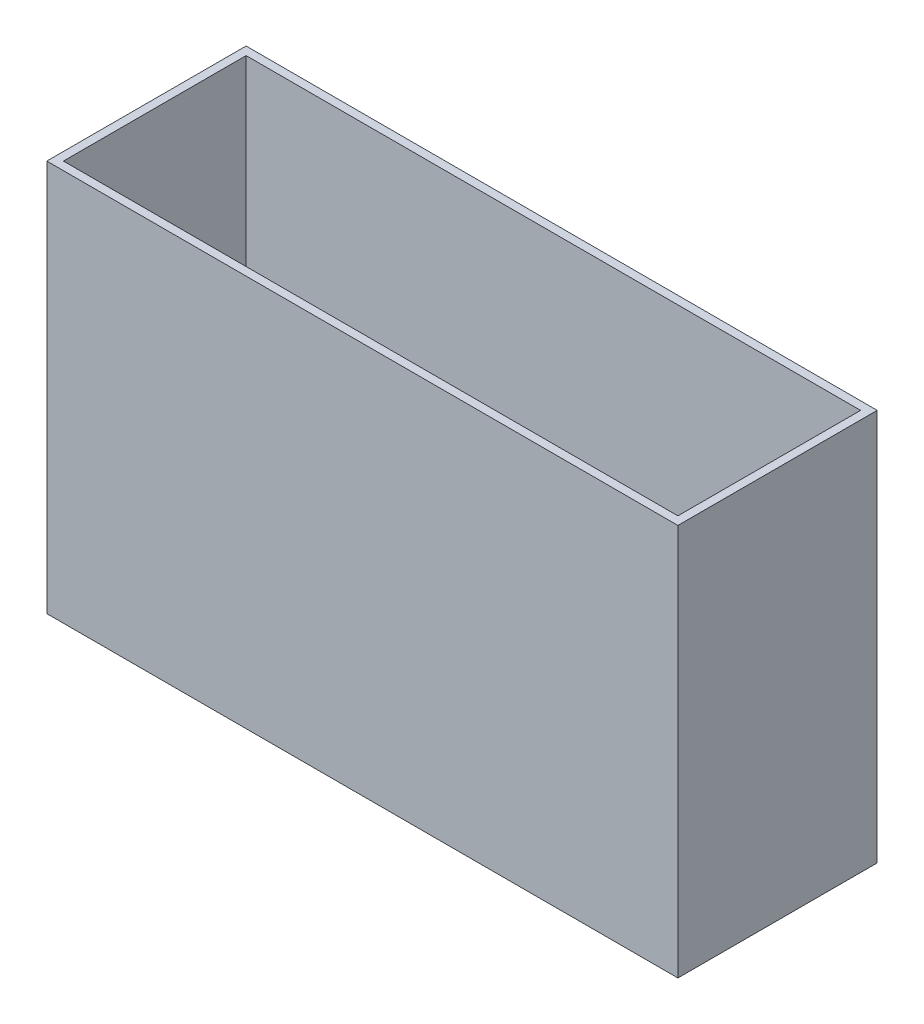
ISO-10303-21;
HEADER;
FILE_DESCRIPTION(('STEP AP214'),'2;1');
FILE_NAME('part.step','',(''),(''),'','','');
FILE_SCHEMA(('AUTOMOTIVE_DESIGN { 1 0 10303 214 1 1 1 1 }'));
ENDSEC;
DATA;
#1=APPLICATION_CONTEXT('core data for automotive mechanical design processes');
#2=APPLICATION_PROTOCOL_DEFINITION('international standard','automotive_design',2000,#1);
#3=PRODUCT_CONTEXT('',#1,'mechanical');
#4=PRODUCT('Part','Part','',(#3));
#5=PRODUCT_RELATED_PRODUCT_CATEGORY('part','',(#4));
#6=PRODUCT_DEFINITION_FORMATION('','',#4);
#7=PRODUCT_DEFINITION_CONTEXT('part definition',#1,'design');
#8=PRODUCT_DEFINITION('design','',#6,#7);
#9=PRODUCT_DEFINITION_SHAPE('','',#8);
#10=(LENGTH_UNIT() NAMED_UNIT(*) SI_UNIT(.MILLI.,.METRE.));
#11=(NAMED_UNIT(*) PLANE_ANGLE_UNIT() SI_UNIT($,.RADIAN.));
#12=(NAMED_UNIT(*) SI_UNIT($,.STERADIAN.) SOLID_ANGLE_UNIT());
#13=UNCERTAINTY_MEASURE_WITH_UNIT(LENGTH_MEASURE(1.E-05),#10,'distance_accuracy_value','');
#14=(GEOMETRIC_REPRESENTATION_CONTEXT(3) GLOBAL_UNCERTAINTY_ASSIGNED_CONTEXT((#13)) GLOBAL_UNIT_ASSIGNED_CONTEXT((#10,
#11,#12)) REPRESENTATION_CONTEXT('',''));
#15=CARTESIAN_POINT('',(0.,0.,0.));
#16=DIRECTION('',(0.,0.,1.));
#17=DIRECTION('',(1.,0.,0.));
#18=AXIS2_PLACEMENT_3D('',#15,#16,#17);
#19=CARTESIAN_POINT('',(0.,149.86,0.));
#20=DIRECTION('',(0.,1.,0.));
#21=DIRECTION('',(0.,0.,1.));
#22=AXIS2_PLACEMENT_3D('',#19,#20,#21);
#23=PLANE('',#22);
#24=DIRECTION('',(0.,0.,-1.));
#25=VECTOR('',#24,1.);
#26=CARTESIAN_POINT('',(117.475,149.86,-38.1));
#27=LINE('',#26,#25);
#28=CARTESIAN_POINT('',(117.475,149.86,34.925));
#29=VERTEX_POINT('',#28);
#30=CARTESIAN_POINT('',(117.475,149.86,-34.925));
#31=VERTEX_POINT('',#30);
#32=EDGE_CURVE('E533',#29,#31,#27,.T.);
#33=ORIENTED_EDGE('',*,*,#32,.F.);
#34=DIRECTION('',(1.,0.,0.));
#35=VECTOR('',#34,1.);
#36=CARTESIAN_POINT('',(-120.65,149.86,34.925));
#37=LINE('',#36,#35);
#38=CARTESIAN_POINT('',(-117.475,149.86,34.925));
#39=VERTEX_POINT('',#38);
#40=EDGE_CURVE('E519',#39,#29,#37,.T.);
#41=ORIENTED_EDGE('',*,*,#40,.F.);
#42=DIRECTION('',(0.,0.,1.));
#43=VECTOR('',#42,1.);
#44=CARTESIAN_POINT('',(-117.475,149.86,-38.1));
#45=LINE('',#44,#43);
#46=CARTESIAN_POINT('',(-117.475,149.86,-34.925));
#47=VERTEX_POINT('',#46);
#48=EDGE_CURVE('E546',#47,#39,#45,.T.);
#49=ORIENTED_EDGE('',*,*,#48,.F.);
#50=DIRECTION('',(-1.,0.,0.));
#51=VECTOR('',#50,1.);
#52=CARTESIAN_POINT('',(-120.65,149.86,-34.925));
#53=LINE('',#52,#51);
#54=EDGE_CURVE('E543',#31,#47,#53,.T.);
#55=ORIENTED_EDGE('',*,*,#54,.F.);
#56=EDGE_LOOP('',(#33,#41,#49,#55));
#57=FACE_BOUND('',#56,.T.);
#58=DIRECTION('',(0.,0.,-1.));
#59=VECTOR('',#58,1.);
#60=CARTESIAN_POINT('',(120.65,149.86,-38.1));
#61=LINE('',#60,#59);
#62=CARTESIAN_POINT('',(120.65,149.86,38.1));
#63=VERTEX_POINT('',#62);
#64=CARTESIAN_POINT('',(120.65,149.86,-38.1));
#65=VERTEX_POINT('',#64);
#66=EDGE_CURVE('E552',#63,#65,#61,.T.);
#67=ORIENTED_EDGE('',*,*,#66,.T.);
#68=DIRECTION('',(-1.,0.,0.));
#69=VECTOR('',#68,1.);
#70=CARTESIAN_POINT('',(-120.65,149.86,-38.1));
#71=LINE('',#70,#69);
#72=CARTESIAN_POINT('',(-120.65,149.86,-38.1));
#73=VERTEX_POINT('',#72);
#74=EDGE_CURVE('E556',#65,#73,#71,.T.);
#75=ORIENTED_EDGE('',*,*,#74,.T.);
#76=DIRECTION('',(0.,0.,1.));
#77=VECTOR('',#76,1.);
#78=CARTESIAN_POINT('',(-120.65,149.86,-38.1));
#79=LINE('',#78,#77);
#80=CARTESIAN_POINT('',(-120.65,149.86,38.1));
#81=VERTEX_POINT('',#80);
#82=EDGE_CURVE('E560',#73,#81,#79,.T.);
#83=ORIENTED_EDGE('',*,*,#82,.T.);
#84=DIRECTION('',(1.,0.,0.));
#85=VECTOR('',#84,1.);
#86=CARTESIAN_POINT('',(-120.65,149.86,38.1));
#87=LINE('',#86,#85);
#88=EDGE_CURVE('E563',#81,#63,#87,.T.);
#89=ORIENTED_EDGE('',*,*,#88,.T.);
#90=EDGE_LOOP('',(#67,#75,#83,#89));
#91=FACE_BOUND('',#90,.T.);
#92=ADVANCED_FACE('F46',(#57,#91),#23,.T.);
#93=CARTESIAN_POINT('',(0.,0.,0.));
#94=DIRECTION('',(0.,1.,0.));
#95=DIRECTION('',(0.,0.,1.));
#96=AXIS2_PLACEMENT_3D('',#93,#94,#95);
#97=PLANE('',#96);
#98=DIRECTION('',(1.,0.,0.));
#99=VECTOR('',#98,1.);
#100=CARTESIAN_POINT('',(-120.65,0.,34.925));
#101=LINE('',#100,#99);
#102=CARTESIAN_POINT('',(-117.475,0.,34.925));
#103=VERTEX_POINT('',#102);
#104=CARTESIAN_POINT('',(117.475,0.,34.925));
#105=VERTEX_POINT('',#104);
#106=EDGE_CURVE('E529',#103,#105,#101,.T.);
#107=ORIENTED_EDGE('',*,*,#106,.T.);
#108=DIRECTION('',(0.,0.,-1.));
#109=VECTOR('',#108,1.);
#110=CARTESIAN_POINT('',(117.475,0.,-38.1));
#111=LINE('',#110,#109);
#112=CARTESIAN_POINT('',(117.475,0.,-34.925));
#113=VERTEX_POINT('',#112);
#114=EDGE_CURVE('E508',#105,#113,#111,.T.);
#115=ORIENTED_EDGE('',*,*,#114,.T.);
#116=DIRECTION('',(-1.,0.,0.));
#117=VECTOR('',#116,1.);
#118=CARTESIAN_POINT('',(-120.65,0.,-34.925));
#119=LINE('',#118,#117);
#120=CARTESIAN_POINT('',(-117.475,0.,-34.925));
#121=VERTEX_POINT('',#120);
#122=EDGE_CURVE('E528',#113,#121,#119,.T.);
#123=ORIENTED_EDGE('',*,*,#122,.T.);
#124=DIRECTION('',(0.,0.,1.));
#125=VECTOR('',#124,1.);
#126=CARTESIAN_POINT('',(-117.475,0.,-38.1));
#127=LINE('',#126,#125);
#128=EDGE_CURVE('E534',#121,#103,#127,.T.);
#129=ORIENTED_EDGE('',*,*,#128,.T.);
#130=EDGE_LOOP('',(#107,#115,#123,#129));
#131=FACE_BOUND('',#130,.T.);
#132=DIRECTION('',(0.,0.,-1.));
#133=VECTOR('',#132,1.);
#134=CARTESIAN_POINT('',(120.65,0.,-38.1));
#135=LINE('',#134,#133);
#136=CARTESIAN_POINT('',(120.65,0.,38.1));
#137=VERTEX_POINT('',#136);
#138=CARTESIAN_POINT('',(120.65,0.,-38.1));
#139=VERTEX_POINT('',#138);
#140=EDGE_CURVE('E513',#137,#139,#135,.T.);
#141=ORIENTED_EDGE('',*,*,#140,.F.);
#142=DIRECTION('',(1.,0.,0.));
#143=VECTOR('',#142,1.);
#144=CARTESIAN_POINT('',(-120.65,0.,38.1));
#145=LINE('',#144,#143);
#146=CARTESIAN_POINT('',(-120.65,0.,38.1));
#147=VERTEX_POINT('',#146);
#148=EDGE_CURVE('E557',#147,#137,#145,.T.);
#149=ORIENTED_EDGE('',*,*,#148,.F.);
#150=DIRECTION('',(0.,0.,1.));
#151=VECTOR('',#150,1.);
#152=CARTESIAN_POINT('',(-120.65,0.,-38.1));
#153=LINE('',#152,#151);
#154=CARTESIAN_POINT('',(-120.65,0.,-38.1));
#155=VERTEX_POINT('',#154);
#156=EDGE_CURVE('E573',#155,#147,#153,.T.);
#157=ORIENTED_EDGE('',*,*,#156,.F.);
#158=DIRECTION('',(-1.,0.,0.));
#159=VECTOR('',#158,1.);
#160=CARTESIAN_POINT('',(-120.65,0.,-38.1));
#161=LINE('',#160,#159);
#162=EDGE_CURVE('E570',#139,#155,#161,.T.);
#163=ORIENTED_EDGE('',*,*,#162,.F.);
#164=EDGE_LOOP('',(#141,#149,#157,#163));
#165=FACE_BOUND('',#164,.T.);
#166=ADVANCED_FACE('F596',(#131,#165),#97,.F.);
#167=CARTESIAN_POINT('',(120.65,149.86,-38.1));
#168=DIRECTION('',(-1.,0.,0.));
#169=DIRECTION('',(0.,0.,1.));
#170=AXIS2_PLACEMENT_3D('',#167,#168,#169);
#171=PLANE('',#170);
#172=ORIENTED_EDGE('',*,*,#140,.T.);
#173=DIRECTION('',(0.,-1.,0.));
#174=VECTOR('',#173,1.);
#175=CARTESIAN_POINT('',(120.65,149.86,-38.1));
#176=LINE('',#175,#174);
#177=EDGE_CURVE('E11',#65,#139,#176,.T.);
#178=ORIENTED_EDGE('',*,*,#177,.F.);
#179=ORIENTED_EDGE('',*,*,#66,.F.);
#180=DIRECTION('',(0.,-1.,0.));
#181=VECTOR('',#180,1.);
#182=CARTESIAN_POINT('',(120.65,149.86,38.1));
#183=LINE('',#182,#181);
#184=EDGE_CURVE('E566',#63,#137,#183,.T.);
#185=ORIENTED_EDGE('',*,*,#184,.T.);
#186=EDGE_LOOP('',(#172,#178,#179,#185));
#187=FACE_BOUND('',#186,.T.);
#188=ADVANCED_FACE('F48',(#187),#171,.F.);
#189=CARTESIAN_POINT('',(-120.65,149.86,-38.1));
#190=DIRECTION('',(0.,0.,1.));
#191=DIRECTION('',(1.,0.,0.));
#192=AXIS2_PLACEMENT_3D('',#189,#190,#191);
#193=PLANE('',#192);
#194=DIRECTION('',(-0.863037084836378,-0.505140564790759,0.));
#195=VECTOR('',#194,1.);
#196=CARTESIAN_POINT('',(-22.6342228623828,-17.6008148008485,-38.1));
#197=LINE('',#196,#195);
#198=CARTESIAN_POINT('',(97.5971993464064,52.771327471182,-38.1));
#199=VERTEX_POINT('',#198);
#200=CARTESIAN_POINT('',(60.325,30.9556950265959,-38.1));
#201=VERTEX_POINT('',#200);
#202=EDGE_CURVE('E62',#199,#201,#197,.T.);
#203=ORIENTED_EDGE('',*,*,#202,.F.);
#204=DIRECTION('',(1.,0.,0.));
#205=VECTOR('',#204,1.);
#206=CARTESIAN_POINT('',(-120.65,52.771327471182,-38.1));
#207=LINE('',#206,#205);
#208=CARTESIAN_POINT('',(23.0528006535936,52.771327471182,-38.1));
#209=VERTEX_POINT('',#208);
#210=EDGE_CURVE('E406',#209,#199,#207,.T.);
#211=ORIENTED_EDGE('',*,*,#210,.F.);
#212=DIRECTION('',(-0.863037084836378,0.505140564790759,0.));
#213=VECTOR('',#212,1.);
#214=CARTESIAN_POINT('',(-126.308085035767,140.19311209713,-38.1));
#215=LINE('',#214,#213);
#216=EDGE_CURVE('E381',#201,#209,#215,.T.);
#217=ORIENTED_EDGE('',*,*,#216,.F.);
#218=EDGE_LOOP('',(#203,#211,#217));
#219=FACE_BOUND('',#218,.T.);
#220=DIRECTION('',(0.,1.,0.));
#221=VECTOR('',#220,1.);
#222=CARTESIAN_POINT('',(12.7,149.86,-38.1));
#223=LINE('',#222,#221);
#224=CARTESIAN_POINT('',(12.7,14.8446914806217,-38.1));
#225=VERTEX_POINT('',#224);
#226=CARTESIAN_POINT('',(12.7,52.9446914806217,-38.1));
#227=VERTEX_POINT('',#226);
#228=EDGE_CURVE('E70',#225,#227,#223,.T.);
#229=ORIENTED_EDGE('',*,*,#228,.F.);
#230=DIRECTION('',(-0.947414408186047,-0.320009279805262,0.));
#231=VECTOR('',#230,1.);
#232=CARTESIAN_POINT('',(-66.0600374249414,-11.7581790647475,-38.1));
#233=LINE('',#232,#231);
#234=CARTESIAN_POINT('',(53.9750000000001,28.786196813279,-38.1));
#235=VERTEX_POINT('',#234);
#236=EDGE_CURVE('E375',#235,#225,#233,.T.);
#237=ORIENTED_EDGE('',*,*,#236,.F.);
#238=DIRECTION('',(0.863037084836378,-0.505140564790759,0.));
#239=VECTOR('',#238,1.);
#240=CARTESIAN_POINT('',(-128.874199104904,135.808883706161,-38.1));
#241=LINE('',#240,#239);
#242=EDGE_CURVE('E350',#227,#235,#241,.T.);
#243=ORIENTED_EDGE('',*,*,#242,.F.);
#244=EDGE_LOOP('',(#229,#237,#243));
#245=FACE_BOUND('',#244,.T.);
#246=DIRECTION('',(0.,1.,0.));
#247=VECTOR('',#246,1.);
#248=CARTESIAN_POINT('',(-107.95,149.86,-38.1));
#249=LINE('',#248,#247);
#250=CARTESIAN_POINT('',(-107.95,14.8446914806217,-38.1));
#251=VERTEX_POINT('',#250);
#252=CARTESIAN_POINT('',(-107.95,52.9446914806217,-38.1));
#253=VERTEX_POINT('',#252);
#254=EDGE_CURVE('E418',#251,#253,#249,.T.);
#255=ORIENTED_EDGE('',*,*,#254,.F.);
#256=DIRECTION('',(-0.947414408186047,-0.320009279805262,0.));
#257=VECTOR('',#256,1.);
#258=CARTESIAN_POINT('',(-78.4153139847742,24.8206571397284,-38.1));
#259=LINE('',#258,#257);
#260=CARTESIAN_POINT('',(-66.6749999999999,28.786196813279,-38.1));
#261=VERTEX_POINT('',#260);
#262=EDGE_CURVE('E471',#261,#251,#259,.T.);
#263=ORIENTED_EDGE('',*,*,#262,.F.);
#264=DIRECTION('',(0.863037084836378,-0.505140564790759,0.));
#265=VECTOR('',#264,1.);
#266=CARTESIAN_POINT('',(-159.660096472188,83.2109080735016,-38.1));
#267=LINE('',#266,#265);
#268=EDGE_CURVE('E412',#253,#261,#267,.T.);
#269=ORIENTED_EDGE('',*,*,#268,.F.);
#270=EDGE_LOOP('',(#255,#263,#269));
#271=FACE_BOUND('',#270,.T.);
#272=DIRECTION('',(0.947414408186047,0.320009279805262,0.));
#273=VECTOR('',#272,1.);
#274=CARTESIAN_POINT('',(-64.4343902835306,-16.5710442583326,-38.1));
#275=LINE('',#274,#273);
#276=CARTESIAN_POINT('',(22.225,12.7,-38.1));
#277=VERTEX_POINT('',#276);
#278=CARTESIAN_POINT('',(60.325,25.5690818455298,-38.1));
#279=VERTEX_POINT('',#278);
#280=EDGE_CURVE('E443',#277,#279,#275,.T.);
#281=ORIENTED_EDGE('',*,*,#280,.F.);
#282=DIRECTION('',(-1.,0.,0.));
#283=VECTOR('',#282,1.);
#284=CARTESIAN_POINT('',(-120.65,12.7,-38.1));
#285=LINE('',#284,#283);
#286=CARTESIAN_POINT('',(98.425,12.7,-38.1));
#287=VERTEX_POINT('',#286);
#288=EDGE_CURVE('E439',#287,#277,#285,.T.);
#289=ORIENTED_EDGE('',*,*,#288,.F.);
#290=DIRECTION('',(0.947414408186047,-0.320009279805262,0.));
#291=VECTOR('',#290,1.);
#292=CARTESIAN_POINT('',(-139.799780036971,93.1654643550952,-38.1));
#293=LINE('',#292,#291);
#294=EDGE_CURVE('E413',#279,#287,#293,.T.);
#295=ORIENTED_EDGE('',*,*,#294,.F.);
#296=EDGE_LOOP('',(#281,#289,#295));
#297=FACE_BOUND('',#296,.T.);
#298=DIRECTION('',(-0.863037084836378,-0.505140564790759,0.));
#299=VECTOR('',#298,1.);
#300=CARTESIAN_POINT('',(-53.4201202296662,34.9971608318109,-38.1));
#301=LINE('',#300,#299);
#302=CARTESIAN_POINT('',(-23.0528006535936,52.771327471182,-38.1));
#303=VERTEX_POINT('',#302);
#304=CARTESIAN_POINT('',(-60.325,30.9556950265959,-38.1));
#305=VERTEX_POINT('',#304);
#306=EDGE_CURVE('E259',#303,#305,#301,.T.);
#307=ORIENTED_EDGE('',*,*,#306,.F.);
#308=DIRECTION('',(1.,0.,0.));
#309=VECTOR('',#308,1.);
#310=CARTESIAN_POINT('',(-120.65,52.771327471182,-38.1));
#311=LINE('',#310,#309);
#312=CARTESIAN_POINT('',(-97.5971993464064,52.771327471182,-38.1));
#313=VERTEX_POINT('',#312);
#314=EDGE_CURVE('E270',#313,#303,#311,.T.);
#315=ORIENTED_EDGE('',*,*,#314,.F.);
#316=DIRECTION('',(-0.863037084836378,0.505140564790759,0.));
#317=VECTOR('',#316,1.);
#318=CARTESIAN_POINT('',(-157.09398240305,87.5951364644704,-38.1));
#319=LINE('',#318,#317);
#320=EDGE_CURVE('E267',#305,#313,#319,.T.);
#321=ORIENTED_EDGE('',*,*,#320,.F.);
#322=EDGE_LOOP('',(#307,#315,#321));
#323=FACE_BOUND('',#322,.T.);
#324=DIRECTION('',(0.947414408186047,0.320009279805262,0.));
#325=VECTOR('',#324,1.);
#326=CARTESIAN_POINT('',(-76.7896668433635,20.0077919461433,-38.1));
#327=LINE('',#326,#325);
#328=CARTESIAN_POINT('',(-98.425,12.7,-38.1));
#329=VERTEX_POINT('',#328);
#330=CARTESIAN_POINT('',(-60.325,25.5690818455298,-38.1));
#331=VERTEX_POINT('',#330);
#332=EDGE_CURVE('E347',#329,#331,#327,.T.);
#333=ORIENTED_EDGE('',*,*,#332,.F.);
#334=DIRECTION('',(-1.,0.,0.));
#335=VECTOR('',#334,1.);
#336=CARTESIAN_POINT('',(-120.65,12.7,-38.1));
#337=LINE('',#336,#335);
#338=CARTESIAN_POINT('',(-22.225,12.7,-38.1));
#339=VERTEX_POINT('',#338);
#340=EDGE_CURVE('E343',#339,#329,#337,.T.);
#341=ORIENTED_EDGE('',*,*,#340,.F.);
#342=DIRECTION('',(0.947414408186047,-0.320009279805262,0.));
#343=VECTOR('',#342,1.);
#344=CARTESIAN_POINT('',(-152.155056596804,56.5866281506193,-38.1));
#345=LINE('',#344,#343);
#346=EDGE_CURVE('E318',#331,#339,#345,.T.);
#347=ORIENTED_EDGE('',*,*,#346,.F.);
#348=EDGE_LOOP('',(#333,#341,#347));
#349=FACE_BOUND('',#348,.T.);
#350=DIRECTION('',(0.,-1.,0.));
#351=VECTOR('',#350,1.);
#352=CARTESIAN_POINT('',(-12.7,149.86,-38.1));
#353=LINE('',#352,#351);
#354=CARTESIAN_POINT('',(-12.7,52.9446914806217,-38.1));
#355=VERTEX_POINT('',#354);
#356=CARTESIAN_POINT('',(-12.7,14.8446914806217,-38.1));
#357=VERTEX_POINT('',#356);
#358=EDGE_CURVE('E315',#355,#357,#353,.T.);
#359=ORIENTED_EDGE('',*,*,#358,.F.);
#360=DIRECTION('',(0.863037084836378,0.505140564790759,0.));
#361=VECTOR('',#360,1.);
#362=CARTESIAN_POINT('',(-50.8540061605291,30.6129324408422,-38.1));
#363=LINE('',#362,#361);
#364=CARTESIAN_POINT('',(-53.975,28.7861968132791,-38.1));
#365=VERTEX_POINT('',#364);
#366=EDGE_CURVE('E311',#365,#355,#363,.T.);
#367=ORIENTED_EDGE('',*,*,#366,.F.);
#368=DIRECTION('',(-0.947414408186047,0.320009279805262,0.));
#369=VECTOR('',#368,1.);
#370=CARTESIAN_POINT('',(-150.529409455393,61.3994933442044,-38.1));
#371=LINE('',#370,#369);
#372=EDGE_CURVE('E283',#357,#365,#371,.T.);
#373=ORIENTED_EDGE('',*,*,#372,.F.);
#374=EDGE_LOOP('',(#359,#367,#373));
#375=FACE_BOUND('',#374,.T.);
#376=DIRECTION('',(0.,-1.,0.));
#377=VECTOR('',#376,1.);
#378=CARTESIAN_POINT('',(107.95,149.86,-38.1));
#379=LINE('',#378,#377);
#380=CARTESIAN_POINT('',(107.95,52.9446914806218,-38.1));
#381=VERTEX_POINT('',#380);
#382=CARTESIAN_POINT('',(107.95,14.8446914806217,-38.1));
#383=VERTEX_POINT('',#382);
#384=EDGE_CURVE('E446',#381,#383,#379,.T.);
#385=ORIENTED_EDGE('',*,*,#384,.F.);
#386=DIRECTION('',(0.863037084836378,0.505140564790759,0.));
#387=VECTOR('',#386,1.);
#388=CARTESIAN_POINT('',(-20.0681087932457,-21.9850431918172,-38.1));
#389=LINE('',#388,#387);
#390=CARTESIAN_POINT('',(66.675,28.786196813279,-38.1));
#391=VERTEX_POINT('',#390);
#392=EDGE_CURVE('E479',#391,#381,#389,.T.);
#393=ORIENTED_EDGE('',*,*,#392,.F.);
#394=DIRECTION('',(-0.947414408186047,0.320009279805262,0.));
#395=VECTOR('',#394,1.);
#396=CARTESIAN_POINT('',(-138.17413289556,97.9783295486803,-38.1));
#397=LINE('',#396,#395);
#398=EDGE_CURVE('E498',#383,#391,#397,.T.);
#399=ORIENTED_EDGE('',*,*,#398,.F.);
#400=EDGE_LOOP('',(#385,#393,#399));
#401=FACE_BOUND('',#400,.T.);
#402=ORIENTED_EDGE('',*,*,#162,.T.);
#403=DIRECTION('',(0.,-1.,0.));
#404=VECTOR('',#403,1.);
#405=CARTESIAN_POINT('',(-120.65,149.86,-38.1));
#406=LINE('',#405,#404);
#407=EDGE_CURVE('E55',#73,#155,#406,.T.);
#408=ORIENTED_EDGE('',*,*,#407,.F.);
#409=ORIENTED_EDGE('',*,*,#74,.F.);
#410=ORIENTED_EDGE('',*,*,#177,.T.);
#411=EDGE_LOOP('',(#402,#408,#409,#410));
#412=FACE_BOUND('',#411,.T.);
#413=ADVANCED_FACE('F280',(#219,#245,#271,#297,#323,#349,#375,#401,#412),#193,.F.);
#414=CARTESIAN_POINT('',(-120.65,149.86,-38.1));
#415=DIRECTION('',(1.,0.,0.));
#416=DIRECTION('',(0.,0.,-1.));
#417=AXIS2_PLACEMENT_3D('',#414,#415,#416);
#418=PLANE('',#417);
#419=ORIENTED_EDGE('',*,*,#156,.T.);
#420=DIRECTION('',(0.,-1.,0.));
#421=VECTOR('',#420,1.);
#422=CARTESIAN_POINT('',(-120.65,149.86,38.1));
#423=LINE('',#422,#421);
#424=EDGE_CURVE('E581',#81,#147,#423,.T.);
#425=ORIENTED_EDGE('',*,*,#424,.F.);
#426=ORIENTED_EDGE('',*,*,#82,.F.);
#427=ORIENTED_EDGE('',*,*,#407,.T.);
#428=EDGE_LOOP('',(#419,#425,#426,#427));
#429=FACE_BOUND('',#428,.T.);
#430=ADVANCED_FACE('F590',(#429),#418,.F.);
#431=CARTESIAN_POINT('',(-120.65,149.86,38.1));
#432=DIRECTION('',(0.,0.,-1.));
#433=DIRECTION('',(-1.,0.,0.));
#434=AXIS2_PLACEMENT_3D('',#431,#432,#433);
#435=PLANE('',#434);
#436=ORIENTED_EDGE('',*,*,#148,.T.);
#437=ORIENTED_EDGE('',*,*,#184,.F.);
#438=ORIENTED_EDGE('',*,*,#88,.F.);
#439=ORIENTED_EDGE('',*,*,#424,.T.);
#440=EDGE_LOOP('',(#436,#437,#438,#439));
#441=FACE_BOUND('',#440,.T.);
#442=ADVANCED_FACE('F599',(#441),#435,.F.);
#443=CARTESIAN_POINT('',(117.475,149.86,-38.1));
#444=DIRECTION('',(-1.,0.,0.));
#445=DIRECTION('',(0.,0.,1.));
#446=AXIS2_PLACEMENT_3D('',#443,#444,#445);
#447=PLANE('',#446);
#448=ORIENTED_EDGE('',*,*,#114,.F.);
#449=DIRECTION('',(0.,-1.,0.));
#450=VECTOR('',#449,1.);
#451=CARTESIAN_POINT('',(117.475,149.86,34.925));
#452=LINE('',#451,#450);
#453=EDGE_CURVE('E515',#29,#105,#452,.T.);
#454=ORIENTED_EDGE('',*,*,#453,.F.);
#455=ORIENTED_EDGE('',*,*,#32,.T.);
#456=DIRECTION('',(0.,-1.,0.));
#457=VECTOR('',#456,1.);
#458=CARTESIAN_POINT('',(117.475,149.86,-34.925));
#459=LINE('',#458,#457);
#460=EDGE_CURVE('E509',#31,#113,#459,.T.);
#461=ORIENTED_EDGE('',*,*,#460,.T.);
#462=EDGE_LOOP('',(#448,#454,#455,#461));
#463=FACE_BOUND('',#462,.T.);
#464=ADVANCED_FACE('F629',(#463),#447,.T.);
#465=CARTESIAN_POINT('',(-120.65,149.86,-34.925));
#466=DIRECTION('',(0.,0.,1.));
#467=DIRECTION('',(1.,0.,0.));
#468=AXIS2_PLACEMENT_3D('',#465,#466,#467);
#469=PLANE('',#468);
#470=DIRECTION('',(-1.,0.,0.));
#471=VECTOR('',#470,1.);
#472=CARTESIAN_POINT('',(-120.65,52.771327471182,-34.925));
#473=LINE('',#472,#471);
#474=CARTESIAN_POINT('',(97.5971993464064,52.771327471182,-34.925));
#475=VERTEX_POINT('',#474);
#476=CARTESIAN_POINT('',(23.0528006535936,52.771327471182,-34.925));
#477=VERTEX_POINT('',#476);
#478=EDGE_CURVE('E403',#475,#477,#473,.T.);
#479=ORIENTED_EDGE('',*,*,#478,.F.);
#480=DIRECTION('',(0.863037084836378,0.505140564790759,0.));
#481=VECTOR('',#480,1.);
#482=CARTESIAN_POINT('',(-22.6342228623828,-17.6008148008485,-34.925));
#483=LINE('',#482,#481);
#484=CARTESIAN_POINT('',(60.325,30.9556950265959,-34.925));
#485=VERTEX_POINT('',#484);
#486=EDGE_CURVE('E390',#485,#475,#483,.T.);
#487=ORIENTED_EDGE('',*,*,#486,.F.);
#488=DIRECTION('',(0.863037084836378,-0.505140564790759,0.));
#489=VECTOR('',#488,1.);
#490=CARTESIAN_POINT('',(-126.308085035767,140.19311209713,-34.925));
#491=LINE('',#490,#489);
#492=EDGE_CURVE('E399',#477,#485,#491,.T.);
#493=ORIENTED_EDGE('',*,*,#492,.F.);
#494=EDGE_LOOP('',(#479,#487,#493));
#495=FACE_BOUND('',#494,.T.);
#496=DIRECTION('',(0.947414408186047,0.320009279805262,0.));
#497=VECTOR('',#496,1.);
#498=CARTESIAN_POINT('',(-66.0600374249414,-11.7581790647475,-34.925));
#499=LINE('',#498,#497);
#500=CARTESIAN_POINT('',(12.7,14.8446914806217,-34.925));
#501=VERTEX_POINT('',#500);
#502=CARTESIAN_POINT('',(53.9750000000001,28.786196813279,-34.925));
#503=VERTEX_POINT('',#502);
#504=EDGE_CURVE('E372',#501,#503,#499,.T.);
#505=ORIENTED_EDGE('',*,*,#504,.F.);
#506=DIRECTION('',(0.,-1.,0.));
#507=VECTOR('',#506,1.);
#508=CARTESIAN_POINT('',(12.7,149.86,-34.925));
#509=LINE('',#508,#507);
#510=CARTESIAN_POINT('',(12.7,52.9446914806217,-34.925));
#511=VERTEX_POINT('',#510);
#512=EDGE_CURVE('E359',#511,#501,#509,.T.);
#513=ORIENTED_EDGE('',*,*,#512,.F.);
#514=DIRECTION('',(-0.863037084836378,0.505140564790759,0.));
#515=VECTOR('',#514,1.);
#516=CARTESIAN_POINT('',(-128.874199104904,135.808883706161,-34.925));
#517=LINE('',#516,#515);
#518=EDGE_CURVE('E368',#503,#511,#517,.T.);
#519=ORIENTED_EDGE('',*,*,#518,.F.);
#520=EDGE_LOOP('',(#505,#513,#519));
#521=FACE_BOUND('',#520,.T.);
#522=DIRECTION('',(0.947414408186047,0.320009279805262,0.));
#523=VECTOR('',#522,1.);
#524=CARTESIAN_POINT('',(-78.4153139847742,24.8206571397284,-34.925));
#525=LINE('',#524,#523);
#526=CARTESIAN_POINT('',(-107.95,14.8446914806217,-34.925));
#527=VERTEX_POINT('',#526);
#528=CARTESIAN_POINT('',(-66.6749999999999,28.786196813279,-34.925));
#529=VERTEX_POINT('',#528);
#530=EDGE_CURVE('E468',#527,#529,#525,.T.);
#531=ORIENTED_EDGE('',*,*,#530,.F.);
#532=DIRECTION('',(0.,-1.,0.));
#533=VECTOR('',#532,1.);
#534=CARTESIAN_POINT('',(-107.95,149.86,-34.925));
#535=LINE('',#534,#533);
#536=CARTESIAN_POINT('',(-107.95,52.9446914806217,-34.925));
#537=VERTEX_POINT('',#536);
#538=EDGE_CURVE('E455',#537,#527,#535,.T.);
#539=ORIENTED_EDGE('',*,*,#538,.F.);
#540=DIRECTION('',(-0.863037084836378,0.505140564790759,0.));
#541=VECTOR('',#540,1.);
#542=CARTESIAN_POINT('',(-159.660096472188,83.2109080735016,-34.925));
#543=LINE('',#542,#541);
#544=EDGE_CURVE('E464',#529,#537,#543,.T.);
#545=ORIENTED_EDGE('',*,*,#544,.F.);
#546=EDGE_LOOP('',(#531,#539,#545));
#547=FACE_BOUND('',#546,.T.);
#548=DIRECTION('',(1.,0.,0.));
#549=VECTOR('',#548,1.);
#550=CARTESIAN_POINT('',(-120.65,12.7,-34.925));
#551=LINE('',#550,#549);
#552=CARTESIAN_POINT('',(22.225,12.7,-34.925));
#553=VERTEX_POINT('',#552);
#554=CARTESIAN_POINT('',(98.425,12.7,-34.925));
#555=VERTEX_POINT('',#554);
#556=EDGE_CURVE('E436',#553,#555,#551,.T.);
#557=ORIENTED_EDGE('',*,*,#556,.F.);
#558=DIRECTION('',(-0.947414408186047,-0.320009279805262,0.));
#559=VECTOR('',#558,1.);
#560=CARTESIAN_POINT('',(-64.4343902835306,-16.5710442583326,-34.925));
#561=LINE('',#560,#559);
#562=CARTESIAN_POINT('',(60.325,25.5690818455299,-34.925));
#563=VERTEX_POINT('',#562);
#564=EDGE_CURVE('E423',#563,#553,#561,.T.);
#565=ORIENTED_EDGE('',*,*,#564,.F.);
#566=DIRECTION('',(-0.947414408186047,0.320009279805262,0.));
#567=VECTOR('',#566,1.);
#568=CARTESIAN_POINT('',(-139.799780036971,93.1654643550952,-34.925));
#569=LINE('',#568,#567);
#570=EDGE_CURVE('E432',#555,#563,#569,.T.);
#571=ORIENTED_EDGE('',*,*,#570,.F.);
#572=EDGE_LOOP('',(#557,#565,#571));
#573=FACE_BOUND('',#572,.T.);
#574=DIRECTION('',(-1.,0.,0.));
#575=VECTOR('',#574,1.);
#576=CARTESIAN_POINT('',(-120.65,52.771327471182,-34.925));
#577=LINE('',#576,#575);
#578=CARTESIAN_POINT('',(-23.0528006535936,52.771327471182,-34.925));
#579=VERTEX_POINT('',#578);
#580=CARTESIAN_POINT('',(-97.5971993464064,52.771327471182,-34.925));
#581=VERTEX_POINT('',#580);
#582=EDGE_CURVE('E278',#579,#581,#577,.T.);
#583=ORIENTED_EDGE('',*,*,#582,.F.);
#584=DIRECTION('',(0.863037084836378,0.505140564790759,0.));
#585=VECTOR('',#584,1.);
#586=CARTESIAN_POINT('',(-53.4201202296662,34.9971608318109,-34.925));
#587=LINE('',#586,#585);
#588=CARTESIAN_POINT('',(-60.325,30.9556950265959,-34.925));
#589=VERTEX_POINT('',#588);
#590=EDGE_CURVE('E262',#589,#579,#587,.T.);
#591=ORIENTED_EDGE('',*,*,#590,.F.);
#592=DIRECTION('',(0.863037084836378,-0.505140564790759,0.));
#593=VECTOR('',#592,1.);
#594=CARTESIAN_POINT('',(-157.09398240305,87.5951364644704,-34.925));
#595=LINE('',#594,#593);
#596=EDGE_CURVE('E959',#581,#589,#595,.T.);
#597=ORIENTED_EDGE('',*,*,#596,.F.);
#598=EDGE_LOOP('',(#583,#591,#597));
#599=FACE_BOUND('',#598,.T.);
#600=DIRECTION('',(1.,0.,0.));
#601=VECTOR('',#600,1.);
#602=CARTESIAN_POINT('',(-120.65,12.7,-34.925));
#603=LINE('',#602,#601);
#604=CARTESIAN_POINT('',(-98.425,12.7,-34.925));
#605=VERTEX_POINT('',#604);
#606=CARTESIAN_POINT('',(-22.225,12.7,-34.925));
#607=VERTEX_POINT('',#606);
#608=EDGE_CURVE('E340',#605,#607,#603,.T.);
#609=ORIENTED_EDGE('',*,*,#608,.F.);
#610=DIRECTION('',(-0.947414408186047,-0.320009279805262,0.));
#611=VECTOR('',#610,1.);
#612=CARTESIAN_POINT('',(-76.7896668433635,20.0077919461433,-34.925));
#613=LINE('',#612,#611);
#614=CARTESIAN_POINT('',(-60.325,25.5690818455298,-34.925));
#615=VERTEX_POINT('',#614);
#616=EDGE_CURVE('E327',#615,#605,#613,.T.);
#617=ORIENTED_EDGE('',*,*,#616,.F.);
#618=DIRECTION('',(-0.947414408186047,0.320009279805262,0.));
#619=VECTOR('',#618,1.);
#620=CARTESIAN_POINT('',(-152.155056596804,56.5866281506193,-34.925));
#621=LINE('',#620,#619);
#622=EDGE_CURVE('E336',#607,#615,#621,.T.);
#623=ORIENTED_EDGE('',*,*,#622,.F.);
#624=EDGE_LOOP('',(#609,#617,#623));
#625=FACE_BOUND('',#624,.T.);
#626=DIRECTION('',(-0.863037084836378,-0.505140564790759,0.));
#627=VECTOR('',#626,1.);
#628=CARTESIAN_POINT('',(-50.8540061605291,30.6129324408422,-34.925));
#629=LINE('',#628,#627);
#630=CARTESIAN_POINT('',(-12.7,52.9446914806217,-34.925));
#631=VERTEX_POINT('',#630);
#632=CARTESIAN_POINT('',(-53.975,28.786196813279,-34.925));
#633=VERTEX_POINT('',#632);
#634=EDGE_CURVE('E308',#631,#633,#629,.T.);
#635=ORIENTED_EDGE('',*,*,#634,.F.);
#636=DIRECTION('',(0.,1.,0.));
#637=VECTOR('',#636,1.);
#638=CARTESIAN_POINT('',(-12.7,149.86,-34.925));
#639=LINE('',#638,#637);
#640=CARTESIAN_POINT('',(-12.7,14.8446914806217,-34.925));
#641=VERTEX_POINT('',#640);
#642=EDGE_CURVE('E295',#641,#631,#639,.T.);
#643=ORIENTED_EDGE('',*,*,#642,.F.);
#644=DIRECTION('',(0.947414408186047,-0.320009279805262,0.));
#645=VECTOR('',#644,1.);
#646=CARTESIAN_POINT('',(-150.529409455393,61.3994933442044,-34.925));
#647=LINE('',#646,#645);
#648=EDGE_CURVE('E304',#633,#641,#647,.T.);
#649=ORIENTED_EDGE('',*,*,#648,.F.);
#650=EDGE_LOOP('',(#635,#643,#649));
#651=FACE_BOUND('',#650,.T.);
#652=DIRECTION('',(-0.863037084836378,-0.505140564790759,0.));
#653=VECTOR('',#652,1.);
#654=CARTESIAN_POINT('',(-20.0681087932457,-21.9850431918172,-34.925));
#655=LINE('',#654,#653);
#656=CARTESIAN_POINT('',(107.95,52.9446914806218,-34.925));
#657=VERTEX_POINT('',#656);
#658=CARTESIAN_POINT('',(66.675,28.786196813279,-34.925));
#659=VERTEX_POINT('',#658);
#660=EDGE_CURVE('E483',#657,#659,#655,.T.);
#661=ORIENTED_EDGE('',*,*,#660,.F.);
#662=DIRECTION('',(0.,1.,0.));
#663=VECTOR('',#662,1.);
#664=CARTESIAN_POINT('',(107.95,149.86,-34.925));
#665=LINE('',#664,#663);
#666=CARTESIAN_POINT('',(107.95,14.8446914806217,-34.925));
#667=VERTEX_POINT('',#666);
#668=EDGE_CURVE('E490',#667,#657,#665,.T.);
#669=ORIENTED_EDGE('',*,*,#668,.F.);
#670=DIRECTION('',(0.947414408186047,-0.320009279805262,0.));
#671=VECTOR('',#670,1.);
#672=CARTESIAN_POINT('',(-138.17413289556,97.9783295486803,-34.925));
#673=LINE('',#672,#671);
#674=EDGE_CURVE('E486',#659,#667,#673,.T.);
#675=ORIENTED_EDGE('',*,*,#674,.F.);
#676=EDGE_LOOP('',(#661,#669,#675));
#677=FACE_BOUND('',#676,.T.);
#678=ORIENTED_EDGE('',*,*,#122,.F.);
#679=ORIENTED_EDGE('',*,*,#460,.F.);
#680=ORIENTED_EDGE('',*,*,#54,.T.);
#681=DIRECTION('',(0.,-1.,0.));
#682=VECTOR('',#681,1.);
#683=CARTESIAN_POINT('',(-117.475,149.86,-34.925));
#684=LINE('',#683,#682);
#685=EDGE_CURVE('E514',#47,#121,#684,.T.);
#686=ORIENTED_EDGE('',*,*,#685,.T.);
#687=EDGE_LOOP('',(#678,#679,#680,#686));
#688=FACE_BOUND('',#687,.T.);
#689=ADVANCED_FACE('F633',(#495,#521,#547,#573,#599,#625,#651,#677,#688),#469,.T.);
#690=CARTESIAN_POINT('',(-117.475,149.86,-38.1));
#691=DIRECTION('',(1.,0.,0.));
#692=DIRECTION('',(0.,0.,-1.));
#693=AXIS2_PLACEMENT_3D('',#690,#691,#692);
#694=PLANE('',#693);
#695=ORIENTED_EDGE('',*,*,#128,.F.);
#696=ORIENTED_EDGE('',*,*,#685,.F.);
#697=ORIENTED_EDGE('',*,*,#48,.T.);
#698=DIRECTION('',(0.,-1.,0.));
#699=VECTOR('',#698,1.);
#700=CARTESIAN_POINT('',(-117.475,149.86,34.925));
#701=LINE('',#700,#699);
#702=EDGE_CURVE('E518',#39,#103,#701,.T.);
#703=ORIENTED_EDGE('',*,*,#702,.T.);
#704=EDGE_LOOP('',(#695,#696,#697,#703));
#705=FACE_BOUND('',#704,.T.);
#706=ADVANCED_FACE('F639',(#705),#694,.T.);
#707=CARTESIAN_POINT('',(-120.65,149.86,34.925));
#708=DIRECTION('',(0.,0.,-1.));
#709=DIRECTION('',(-1.,0.,0.));
#710=AXIS2_PLACEMENT_3D('',#707,#708,#709);
#711=PLANE('',#710);
#712=ORIENTED_EDGE('',*,*,#106,.F.);
#713=ORIENTED_EDGE('',*,*,#702,.F.);
#714=ORIENTED_EDGE('',*,*,#40,.T.);
#715=ORIENTED_EDGE('',*,*,#453,.T.);
#716=EDGE_LOOP('',(#712,#713,#714,#715));
#717=FACE_BOUND('',#716,.T.);
#718=ADVANCED_FACE('F626',(#717),#711,.T.);
#719=CARTESIAN_POINT('',(-20.0681087932457,-21.9850431918172,-38.101));
#720=DIRECTION('',(-0.505140564790759,0.863037084836378,0.));
#721=DIRECTION('',(-0.863037084836378,-0.505140564790759,0.));
#722=AXIS2_PLACEMENT_3D('',#719,#720,#721);
#723=PLANE('',#722);
#724=ORIENTED_EDGE('',*,*,#392,.T.);
#725=DIRECTION('',(0.,0.,1.));
#726=VECTOR('',#725,1.);
#727=CARTESIAN_POINT('',(107.95,52.9446914806218,-38.101));
#728=LINE('',#727,#726);
#729=EDGE_CURVE('E495',#381,#657,#728,.T.);
#730=ORIENTED_EDGE('',*,*,#729,.T.);
#731=ORIENTED_EDGE('',*,*,#660,.T.);
#732=DIRECTION('',(0.,0.,1.));
#733=VECTOR('',#732,1.);
#734=CARTESIAN_POINT('',(66.675,28.786196813279,-38.101));
#735=LINE('',#734,#733);
#736=EDGE_CURVE('E494',#391,#659,#735,.T.);
#737=ORIENTED_EDGE('',*,*,#736,.F.);
#738=EDGE_LOOP('',(#724,#730,#731,#737));
#739=FACE_BOUND('',#738,.T.);
#740=ADVANCED_FACE('F644',(#739),#723,.F.);
#741=CARTESIAN_POINT('',(107.95,149.86,-38.101));
#742=DIRECTION('',(1.,0.,0.));
#743=DIRECTION('',(0.,0.,-1.));
#744=AXIS2_PLACEMENT_3D('',#741,#742,#743);
#745=PLANE('',#744);
#746=ORIENTED_EDGE('',*,*,#384,.T.);
#747=DIRECTION('',(0.,0.,1.));
#748=VECTOR('',#747,1.);
#749=CARTESIAN_POINT('',(107.95,14.8446914806217,-38.101));
#750=LINE('',#749,#748);
#751=EDGE_CURVE('E499',#383,#667,#750,.T.);
#752=ORIENTED_EDGE('',*,*,#751,.T.);
#753=ORIENTED_EDGE('',*,*,#668,.T.);
#754=ORIENTED_EDGE('',*,*,#729,.F.);
#755=EDGE_LOOP('',(#746,#752,#753,#754));
#756=FACE_BOUND('',#755,.T.);
#757=ADVANCED_FACE('F661',(#756),#745,.F.);
#758=CARTESIAN_POINT('',(-138.17413289556,97.9783295486803,-38.101));
#759=DIRECTION('',(-0.320009279805262,-0.947414408186047,0.));
#760=DIRECTION('',(0.947414408186047,-0.320009279805262,0.));
#761=AXIS2_PLACEMENT_3D('',#758,#759,#760);
#762=PLANE('',#761);
#763=ORIENTED_EDGE('',*,*,#398,.T.);
#764=ORIENTED_EDGE('',*,*,#736,.T.);
#765=ORIENTED_EDGE('',*,*,#674,.T.);
#766=ORIENTED_EDGE('',*,*,#751,.F.);
#767=EDGE_LOOP('',(#763,#764,#765,#766));
#768=FACE_BOUND('',#767,.T.);
#769=ADVANCED_FACE('F666',(#768),#762,.F.);
#770=CARTESIAN_POINT('',(-50.8540061605291,30.6129324408422,-38.101));
#771=DIRECTION('',(-0.505140564790759,0.863037084836378,0.));
#772=DIRECTION('',(-0.863037084836378,-0.505140564790759,0.));
#773=AXIS2_PLACEMENT_3D('',#770,#771,#772);
#774=PLANE('',#773);
#775=ORIENTED_EDGE('',*,*,#366,.T.);
#776=DIRECTION('',(0.,0.,1.));
#777=VECTOR('',#776,1.);
#778=CARTESIAN_POINT('',(-12.7,52.9446914806217,-38.101));
#779=LINE('',#778,#777);
#780=EDGE_CURVE('E287',#355,#631,#779,.T.);
#781=ORIENTED_EDGE('',*,*,#780,.T.);
#782=ORIENTED_EDGE('',*,*,#634,.T.);
#783=DIRECTION('',(0.,0.,1.));
#784=VECTOR('',#783,1.);
#785=CARTESIAN_POINT('',(-53.975,28.7861968132791,-38.101));
#786=LINE('',#785,#784);
#787=EDGE_CURVE('E291',#365,#633,#786,.T.);
#788=ORIENTED_EDGE('',*,*,#787,.F.);
#789=EDGE_LOOP('',(#775,#781,#782,#788));
#790=FACE_BOUND('',#789,.T.);
#791=ADVANCED_FACE('F680',(#790),#774,.F.);
#792=CARTESIAN_POINT('',(-12.7,149.86,-38.101));
#793=DIRECTION('',(1.,0.,0.));
#794=DIRECTION('',(0.,0.,-1.));
#795=AXIS2_PLACEMENT_3D('',#792,#793,#794);
#796=PLANE('',#795);
#797=ORIENTED_EDGE('',*,*,#358,.T.);
#798=DIRECTION('',(0.,0.,1.));
#799=VECTOR('',#798,1.);
#800=CARTESIAN_POINT('',(-12.7,14.8446914806217,-38.101));
#801=LINE('',#800,#799);
#802=EDGE_CURVE('E296',#357,#641,#801,.T.);
#803=ORIENTED_EDGE('',*,*,#802,.T.);
#804=ORIENTED_EDGE('',*,*,#642,.T.);
#805=ORIENTED_EDGE('',*,*,#780,.F.);
#806=EDGE_LOOP('',(#797,#803,#804,#805));
#807=FACE_BOUND('',#806,.T.);
#808=ADVANCED_FACE('F684',(#807),#796,.F.);
#809=CARTESIAN_POINT('',(-150.529409455393,61.3994933442044,-38.101));
#810=DIRECTION('',(-0.320009279805262,-0.947414408186047,0.));
#811=DIRECTION('',(0.947414408186047,-0.320009279805262,0.));
#812=AXIS2_PLACEMENT_3D('',#809,#810,#811);
#813=PLANE('',#812);
#814=ORIENTED_EDGE('',*,*,#372,.T.);
#815=ORIENTED_EDGE('',*,*,#787,.T.);
#816=ORIENTED_EDGE('',*,*,#648,.T.);
#817=ORIENTED_EDGE('',*,*,#802,.F.);
#818=EDGE_LOOP('',(#814,#815,#816,#817));
#819=FACE_BOUND('',#818,.T.);
#820=ADVANCED_FACE('F746',(#819),#813,.F.);
#821=CARTESIAN_POINT('',(-120.65,12.7,-38.101));
#822=DIRECTION('',(0.,-1.,0.));
#823=DIRECTION('',(0.,0.,-1.));
#824=AXIS2_PLACEMENT_3D('',#821,#822,#823);
#825=PLANE('',#824);
#826=ORIENTED_EDGE('',*,*,#340,.T.);
#827=DIRECTION('',(0.,0.,1.));
#828=VECTOR('',#827,1.);
#829=CARTESIAN_POINT('',(-98.425,12.7,-38.101));
#830=LINE('',#829,#828);
#831=EDGE_CURVE('E322',#329,#605,#830,.T.);
#832=ORIENTED_EDGE('',*,*,#831,.T.);
#833=ORIENTED_EDGE('',*,*,#608,.T.);
#834=DIRECTION('',(0.,0.,1.));
#835=VECTOR('',#834,1.);
#836=CARTESIAN_POINT('',(-22.225,12.7,-38.101));
#837=LINE('',#836,#835);
#838=EDGE_CURVE('E323',#339,#607,#837,.T.);
#839=ORIENTED_EDGE('',*,*,#838,.F.);
#840=EDGE_LOOP('',(#826,#832,#833,#839));
#841=FACE_BOUND('',#840,.T.);
#842=ADVANCED_FACE('F739',(#841),#825,.F.);
#843=CARTESIAN_POINT('',(-76.7896668433635,20.0077919461433,-38.101));
#844=DIRECTION('',(-0.320009279805262,0.947414408186047,0.));
#845=DIRECTION('',(-0.947414408186047,-0.320009279805262,0.));
#846=AXIS2_PLACEMENT_3D('',#843,#844,#845);
#847=PLANE('',#846);
#848=ORIENTED_EDGE('',*,*,#332,.T.);
#849=DIRECTION('',(0.,0.,1.));
#850=VECTOR('',#849,1.);
#851=CARTESIAN_POINT('',(-60.325,25.5690818455298,-38.101));
#852=LINE('',#851,#850);
#853=EDGE_CURVE('E328',#331,#615,#852,.T.);
#854=ORIENTED_EDGE('',*,*,#853,.T.);
#855=ORIENTED_EDGE('',*,*,#616,.T.);
#856=ORIENTED_EDGE('',*,*,#831,.F.);
#857=EDGE_LOOP('',(#848,#854,#855,#856));
#858=FACE_BOUND('',#857,.T.);
#859=ADVANCED_FACE('F735',(#858),#847,.F.);
#860=CARTESIAN_POINT('',(-152.155056596804,56.5866281506193,-38.101));
#861=DIRECTION('',(0.320009279805262,0.947414408186047,0.));
#862=DIRECTION('',(-0.947414408186047,0.320009279805262,0.));
#863=AXIS2_PLACEMENT_3D('',#860,#861,#862);
#864=PLANE('',#863);
#865=ORIENTED_EDGE('',*,*,#346,.T.);
#866=ORIENTED_EDGE('',*,*,#838,.T.);
#867=ORIENTED_EDGE('',*,*,#622,.T.);
#868=ORIENTED_EDGE('',*,*,#853,.F.);
#869=EDGE_LOOP('',(#865,#866,#867,#868));
#870=FACE_BOUND('',#869,.T.);
#871=ADVANCED_FACE('F738',(#870),#864,.F.);
#872=CARTESIAN_POINT('',(-120.65,52.771327471182,-38.101));
#873=DIRECTION('',(0.,1.,0.));
#874=DIRECTION('',(0.,0.,1.));
#875=AXIS2_PLACEMENT_3D('',#872,#873,#874);
#876=PLANE('',#875);
#877=ORIENTED_EDGE('',*,*,#314,.T.);
#878=DIRECTION('',(0.,0.,1.));
#879=VECTOR('',#878,1.);
#880=CARTESIAN_POINT('',(-23.0528006535936,52.771327471182,-38.101));
#881=LINE('',#880,#879);
#882=EDGE_CURVE('E255',#303,#579,#881,.T.);
#883=ORIENTED_EDGE('',*,*,#882,.T.);
#884=ORIENTED_EDGE('',*,*,#582,.T.);
#885=DIRECTION('',(0.,0.,1.));
#886=VECTOR('',#885,1.);
#887=CARTESIAN_POINT('',(-97.5971993464064,52.771327471182,-38.101));
#888=LINE('',#887,#886);
#889=EDGE_CURVE('E273',#313,#581,#888,.T.);
#890=ORIENTED_EDGE('',*,*,#889,.F.);
#891=EDGE_LOOP('',(#877,#883,#884,#890));
#892=FACE_BOUND('',#891,.T.);
#893=ADVANCED_FACE('F271',(#892),#876,.F.);
#894=CARTESIAN_POINT('',(-53.4201202296662,34.9971608318109,-38.101));
#895=DIRECTION('',(0.505140564790759,-0.863037084836378,0.));
#896=DIRECTION('',(0.863037084836378,0.505140564790759,0.));
#897=AXIS2_PLACEMENT_3D('',#894,#895,#896);
#898=PLANE('',#897);
#899=ORIENTED_EDGE('',*,*,#306,.T.);
#900=DIRECTION('',(0.,0.,1.));
#901=VECTOR('',#900,1.);
#902=CARTESIAN_POINT('',(-60.325,30.9556950265959,-38.101));
#903=LINE('',#902,#901);
#904=EDGE_CURVE('E266',#305,#589,#903,.T.);
#905=ORIENTED_EDGE('',*,*,#904,.T.);
#906=ORIENTED_EDGE('',*,*,#590,.T.);
#907=ORIENTED_EDGE('',*,*,#882,.F.);
#908=EDGE_LOOP('',(#899,#905,#906,#907));
#909=FACE_BOUND('',#908,.T.);
#910=ADVANCED_FACE('F257',(#909),#898,.F.);
#911=CARTESIAN_POINT('',(-157.09398240305,87.5951364644704,-38.101));
#912=DIRECTION('',(-0.505140564790759,-0.863037084836378,0.));
#913=DIRECTION('',(0.863037084836378,-0.505140564790759,0.));
#914=AXIS2_PLACEMENT_3D('',#911,#912,#913);
#915=PLANE('',#914);
#916=ORIENTED_EDGE('',*,*,#320,.T.);
#917=ORIENTED_EDGE('',*,*,#889,.T.);
#918=ORIENTED_EDGE('',*,*,#596,.T.);
#919=ORIENTED_EDGE('',*,*,#904,.F.);
#920=EDGE_LOOP('',(#916,#917,#918,#919));
#921=FACE_BOUND('',#920,.T.);
#922=ADVANCED_FACE('F712',(#921),#915,.F.);
#923=CARTESIAN_POINT('',(-120.65,12.7,-38.101));
#924=DIRECTION('',(0.,-1.,0.));
#925=DIRECTION('',(0.,0.,-1.));
#926=AXIS2_PLACEMENT_3D('',#923,#924,#925);
#927=PLANE('',#926);
#928=ORIENTED_EDGE('',*,*,#288,.T.);
#929=DIRECTION('',(0.,0.,1.));
#930=VECTOR('',#929,1.);
#931=CARTESIAN_POINT('',(22.225,12.7,-38.101));
#932=LINE('',#931,#930);
#933=EDGE_CURVE('E417',#277,#553,#932,.T.);
#934=ORIENTED_EDGE('',*,*,#933,.T.);
#935=ORIENTED_EDGE('',*,*,#556,.T.);
#936=DIRECTION('',(0.,0.,1.));
#937=VECTOR('',#936,1.);
#938=CARTESIAN_POINT('',(98.425,12.7,-38.101));
#939=LINE('',#938,#937);
#940=EDGE_CURVE('E419',#287,#555,#939,.T.);
#941=ORIENTED_EDGE('',*,*,#940,.F.);
#942=EDGE_LOOP('',(#928,#934,#935,#941));
#943=FACE_BOUND('',#942,.T.);
#944=ADVANCED_FACE('F705',(#943),#927,.F.);
#945=CARTESIAN_POINT('',(-64.4343902835306,-16.5710442583326,-38.101));
#946=DIRECTION('',(-0.320009279805262,0.947414408186047,0.));
#947=DIRECTION('',(-0.947414408186047,-0.320009279805262,0.));
#948=AXIS2_PLACEMENT_3D('',#945,#946,#947);
#949=PLANE('',#948);
#950=ORIENTED_EDGE('',*,*,#280,.T.);
#951=DIRECTION('',(0.,0.,1.));
#952=VECTOR('',#951,1.);
#953=CARTESIAN_POINT('',(60.325,25.5690818455299,-38.101));
#954=LINE('',#953,#952);
#955=EDGE_CURVE('E424',#279,#563,#954,.T.);
#956=ORIENTED_EDGE('',*,*,#955,.T.);
#957=ORIENTED_EDGE('',*,*,#564,.T.);
#958=ORIENTED_EDGE('',*,*,#933,.F.);
#959=EDGE_LOOP('',(#950,#956,#957,#958));
#960=FACE_BOUND('',#959,.T.);
#961=ADVANCED_FACE('F702',(#960),#949,.F.);
#962=CARTESIAN_POINT('',(-139.799780036971,93.1654643550952,-38.101));
#963=DIRECTION('',(0.320009279805262,0.947414408186047,0.));
#964=DIRECTION('',(-0.947414408186047,0.320009279805262,0.));
#965=AXIS2_PLACEMENT_3D('',#962,#963,#964);
#966=PLANE('',#965);
#967=ORIENTED_EDGE('',*,*,#294,.T.);
#968=ORIENTED_EDGE('',*,*,#940,.T.);
#969=ORIENTED_EDGE('',*,*,#570,.T.);
#970=ORIENTED_EDGE('',*,*,#955,.F.);
#971=EDGE_LOOP('',(#967,#968,#969,#970));
#972=FACE_BOUND('',#971,.T.);
#973=ADVANCED_FACE('F700',(#972),#966,.F.);
#974=CARTESIAN_POINT('',(-78.4153139847742,24.8206571397284,-38.101));
#975=DIRECTION('',(0.320009279805262,-0.947414408186047,0.));
#976=DIRECTION('',(0.947414408186047,0.320009279805262,0.));
#977=AXIS2_PLACEMENT_3D('',#974,#975,#976);
#978=PLANE('',#977);
#979=ORIENTED_EDGE('',*,*,#262,.T.);
#980=DIRECTION('',(0.,0.,1.));
#981=VECTOR('',#980,1.);
#982=CARTESIAN_POINT('',(-107.95,14.8446914806217,-38.101));
#983=LINE('',#982,#981);
#984=EDGE_CURVE('E450',#251,#527,#983,.T.);
#985=ORIENTED_EDGE('',*,*,#984,.T.);
#986=ORIENTED_EDGE('',*,*,#530,.T.);
#987=DIRECTION('',(0.,0.,1.));
#988=VECTOR('',#987,1.);
#989=CARTESIAN_POINT('',(-66.6749999999999,28.7861968132791,-38.101));
#990=LINE('',#989,#988);
#991=EDGE_CURVE('E451',#261,#529,#990,.T.);
#992=ORIENTED_EDGE('',*,*,#991,.F.);
#993=EDGE_LOOP('',(#979,#985,#986,#992));
#994=FACE_BOUND('',#993,.T.);
#995=ADVANCED_FACE('F692',(#994),#978,.F.);
#996=CARTESIAN_POINT('',(-107.95,149.86,-38.101));
#997=DIRECTION('',(-1.,0.,0.));
#998=DIRECTION('',(0.,0.,1.));
#999=AXIS2_PLACEMENT_3D('',#996,#997,#998);
#1000=PLANE('',#999);
#1001=ORIENTED_EDGE('',*,*,#254,.T.);
#1002=DIRECTION('',(0.,0.,1.));
#1003=VECTOR('',#1002,1.);
#1004=CARTESIAN_POINT('',(-107.95,52.9446914806217,-38.101));
#1005=LINE('',#1004,#1003);
#1006=EDGE_CURVE('E456',#253,#537,#1005,.T.);
#1007=ORIENTED_EDGE('',*,*,#1006,.T.);
#1008=ORIENTED_EDGE('',*,*,#538,.T.);
#1009=ORIENTED_EDGE('',*,*,#984,.F.);
#1010=EDGE_LOOP('',(#1001,#1007,#1008,#1009));
#1011=FACE_BOUND('',#1010,.T.);
#1012=ADVANCED_FACE('F688',(#1011),#1000,.F.);
#1013=CARTESIAN_POINT('',(-159.660096472188,83.2109080735016,-38.101));
#1014=DIRECTION('',(0.505140564790759,0.863037084836378,0.));
#1015=DIRECTION('',(-0.863037084836378,0.505140564790759,0.));
#1016=AXIS2_PLACEMENT_3D('',#1013,#1014,#1015);
#1017=PLANE('',#1016);
#1018=ORIENTED_EDGE('',*,*,#268,.T.);
#1019=ORIENTED_EDGE('',*,*,#991,.T.);
#1020=ORIENTED_EDGE('',*,*,#544,.T.);
#1021=ORIENTED_EDGE('',*,*,#1006,.F.);
#1022=EDGE_LOOP('',(#1018,#1019,#1020,#1021));
#1023=FACE_BOUND('',#1022,.T.);
#1024=ADVANCED_FACE('F691',(#1023),#1017,.F.);
#1025=CARTESIAN_POINT('',(-66.0600374249414,-11.7581790647475,-38.101));
#1026=DIRECTION('',(0.320009279805262,-0.947414408186047,0.));
#1027=DIRECTION('',(0.947414408186047,0.320009279805262,0.));
#1028=AXIS2_PLACEMENT_3D('',#1025,#1026,#1027);
#1029=PLANE('',#1028);
#1030=ORIENTED_EDGE('',*,*,#236,.T.);
#1031=DIRECTION('',(0.,0.,1.));
#1032=VECTOR('',#1031,1.);
#1033=CARTESIAN_POINT('',(12.7,14.8446914806217,-38.101));
#1034=LINE('',#1033,#1032);
#1035=EDGE_CURVE('E354',#225,#501,#1034,.T.);
#1036=ORIENTED_EDGE('',*,*,#1035,.T.);
#1037=ORIENTED_EDGE('',*,*,#504,.T.);
#1038=DIRECTION('',(0.,0.,1.));
#1039=VECTOR('',#1038,1.);
#1040=CARTESIAN_POINT('',(53.9750000000001,28.786196813279,-38.101));
#1041=LINE('',#1040,#1039);
#1042=EDGE_CURVE('E355',#235,#503,#1041,.T.);
#1043=ORIENTED_EDGE('',*,*,#1042,.F.);
#1044=EDGE_LOOP('',(#1030,#1036,#1037,#1043));
#1045=FACE_BOUND('',#1044,.T.);
#1046=ADVANCED_FACE('F696',(#1045),#1029,.F.);
#1047=CARTESIAN_POINT('',(12.7,149.86,-38.101));
#1048=DIRECTION('',(-1.,0.,0.));
#1049=DIRECTION('',(0.,0.,1.));
#1050=AXIS2_PLACEMENT_3D('',#1047,#1048,#1049);
#1051=PLANE('',#1050);
#1052=ORIENTED_EDGE('',*,*,#228,.T.);
#1053=DIRECTION('',(0.,0.,1.));
#1054=VECTOR('',#1053,1.);
#1055=CARTESIAN_POINT('',(12.7,52.9446914806217,-38.101));
#1056=LINE('',#1055,#1054);
#1057=EDGE_CURVE('E360',#227,#511,#1056,.T.);
#1058=ORIENTED_EDGE('',*,*,#1057,.T.);
#1059=ORIENTED_EDGE('',*,*,#512,.T.);
#1060=ORIENTED_EDGE('',*,*,#1035,.F.);
#1061=EDGE_LOOP('',(#1052,#1058,#1059,#1060));
#1062=FACE_BOUND('',#1061,.T.);
#1063=ADVANCED_FACE('F726',(#1062),#1051,.F.);
#1064=CARTESIAN_POINT('',(-128.874199104904,135.808883706161,-38.101));
#1065=DIRECTION('',(0.505140564790759,0.863037084836378,0.));
#1066=DIRECTION('',(-0.863037084836378,0.505140564790759,0.));
#1067=AXIS2_PLACEMENT_3D('',#1064,#1065,#1066);
#1068=PLANE('',#1067);
#1069=ORIENTED_EDGE('',*,*,#242,.T.);
#1070=ORIENTED_EDGE('',*,*,#1042,.T.);
#1071=ORIENTED_EDGE('',*,*,#518,.T.);
#1072=ORIENTED_EDGE('',*,*,#1057,.F.);
#1073=EDGE_LOOP('',(#1069,#1070,#1071,#1072));
#1074=FACE_BOUND('',#1073,.T.);
#1075=ADVANCED_FACE('F724',(#1074),#1068,.F.);
#1076=CARTESIAN_POINT('',(-120.65,52.771327471182,-38.101));
#1077=DIRECTION('',(0.,1.,0.));
#1078=DIRECTION('',(0.,0.,1.));
#1079=AXIS2_PLACEMENT_3D('',#1076,#1077,#1078);
#1080=PLANE('',#1079);
#1081=ORIENTED_EDGE('',*,*,#210,.T.);
#1082=DIRECTION('',(0.,0.,1.));
#1083=VECTOR('',#1082,1.);
#1084=CARTESIAN_POINT('',(97.5971993464064,52.771327471182,-38.101));
#1085=LINE('',#1084,#1083);
#1086=EDGE_CURVE('E385',#199,#475,#1085,.T.);
#1087=ORIENTED_EDGE('',*,*,#1086,.T.);
#1088=ORIENTED_EDGE('',*,*,#478,.T.);
#1089=DIRECTION('',(0.,0.,1.));
#1090=VECTOR('',#1089,1.);
#1091=CARTESIAN_POINT('',(23.0528006535936,52.771327471182,-38.101));
#1092=LINE('',#1091,#1090);
#1093=EDGE_CURVE('E386',#209,#477,#1092,.T.);
#1094=ORIENTED_EDGE('',*,*,#1093,.F.);
#1095=EDGE_LOOP('',(#1081,#1087,#1088,#1094));
#1096=FACE_BOUND('',#1095,.T.);
#1097=ADVANCED_FACE('F718',(#1096),#1080,.F.);
#1098=CARTESIAN_POINT('',(-22.6342228623828,-17.6008148008485,-38.101));
#1099=DIRECTION('',(0.505140564790759,-0.863037084836378,0.));
#1100=DIRECTION('',(0.863037084836378,0.505140564790759,0.));
#1101=AXIS2_PLACEMENT_3D('',#1098,#1099,#1100);
#1102=PLANE('',#1101);
#1103=ORIENTED_EDGE('',*,*,#202,.T.);
#1104=DIRECTION('',(0.,0.,1.));
#1105=VECTOR('',#1104,1.);
#1106=CARTESIAN_POINT('',(60.325,30.9556950265959,-38.101));
#1107=LINE('',#1106,#1105);
#1108=EDGE_CURVE('E391',#201,#485,#1107,.T.);
#1109=ORIENTED_EDGE('',*,*,#1108,.T.);
#1110=ORIENTED_EDGE('',*,*,#486,.T.);
#1111=ORIENTED_EDGE('',*,*,#1086,.F.);
#1112=EDGE_LOOP('',(#1103,#1109,#1110,#1111));
#1113=FACE_BOUND('',#1112,.T.);
#1114=ADVANCED_FACE('F714',(#1113),#1102,.F.);
#1115=CARTESIAN_POINT('',(-126.308085035767,140.19311209713,-38.101));
#1116=DIRECTION('',(-0.505140564790759,-0.863037084836378,0.));
#1117=DIRECTION('',(0.863037084836378,-0.505140564790759,0.));
#1118=AXIS2_PLACEMENT_3D('',#1115,#1116,#1117);
#1119=PLANE('',#1118);
#1120=ORIENTED_EDGE('',*,*,#216,.T.);
#1121=ORIENTED_EDGE('',*,*,#1093,.T.);
#1122=ORIENTED_EDGE('',*,*,#492,.T.);
#1123=ORIENTED_EDGE('',*,*,#1108,.F.);
#1124=EDGE_LOOP('',(#1120,#1121,#1122,#1123));
#1125=FACE_BOUND('',#1124,.T.);
#1126=ADVANCED_FACE('F717',(#1125),#1119,.F.);
#1127=CLOSED_SHELL('',(#92,#166,#188,#413,#430,#442,#464,#689,#706,#718,#740,#757,#769,#791,
#808,#820,#842,#859,#871,#893,#910,#922,#944,#961,#973,#995,#1012,#1024,#1046,#1063,#1075,#1097,
#1114,#1126));
#1128=MANIFOLD_SOLID_BREP('B2',#1127);
#1129=ADVANCED_BREP_SHAPE_REPRESENTATION('',(#18,#1128),#14);
#1130=SHAPE_DEFINITION_REPRESENTATION(#9,#1129);
ENDSEC;
END-ISO-10303-21;
